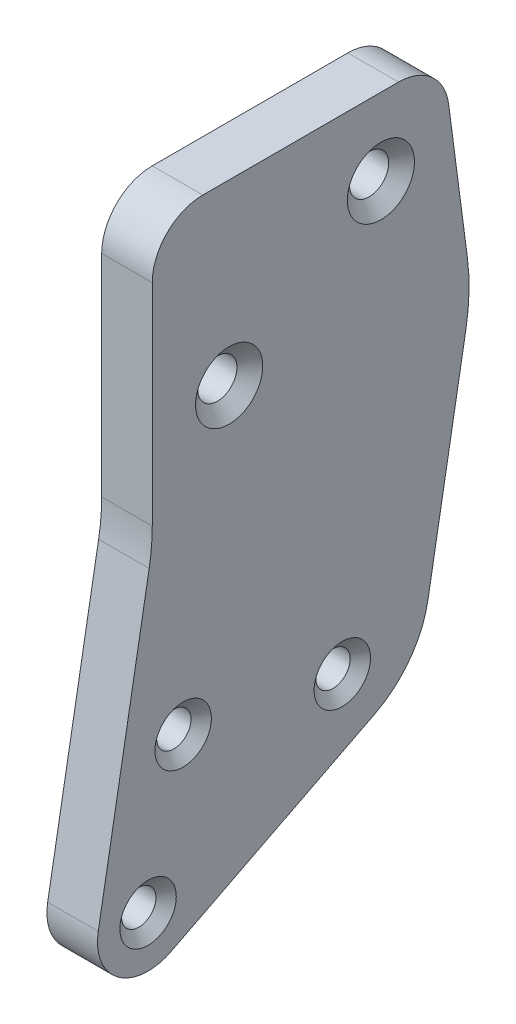
ISO-10303-21;
HEADER;
FILE_DESCRIPTION(('STEP AP214'),'2;1');
FILE_NAME('part.step','',(''),(''),'','','');
FILE_SCHEMA(('AUTOMOTIVE_DESIGN { 1 0 10303 214 1 1 1 1 }'));
ENDSEC;
DATA;
#1=APPLICATION_CONTEXT('core data for automotive mechanical design processes');
#2=APPLICATION_PROTOCOL_DEFINITION('international standard','automotive_design',2000,#1);
#3=PRODUCT_CONTEXT('',#1,'mechanical');
#4=PRODUCT('Part','Part','',(#3));
#5=PRODUCT_RELATED_PRODUCT_CATEGORY('part','',(#4));
#6=PRODUCT_DEFINITION_FORMATION('','',#4);
#7=PRODUCT_DEFINITION_CONTEXT('part definition',#1,'design');
#8=PRODUCT_DEFINITION('design','',#6,#7);
#9=PRODUCT_DEFINITION_SHAPE('','',#8);
#10=(LENGTH_UNIT() NAMED_UNIT(*) SI_UNIT(.MILLI.,.METRE.));
#11=(NAMED_UNIT(*) PLANE_ANGLE_UNIT() SI_UNIT($,.RADIAN.));
#12=(NAMED_UNIT(*) SI_UNIT($,.STERADIAN.) SOLID_ANGLE_UNIT());
#13=UNCERTAINTY_MEASURE_WITH_UNIT(LENGTH_MEASURE(1.E-05),#10,'distance_accuracy_value','');
#14=(GEOMETRIC_REPRESENTATION_CONTEXT(3) GLOBAL_UNCERTAINTY_ASSIGNED_CONTEXT((#13)) GLOBAL_UNIT_ASSIGNED_CONTEXT((#10,
#11,#12)) REPRESENTATION_CONTEXT('',''));
#15=CARTESIAN_POINT('',(0.,0.,0.));
#16=DIRECTION('',(0.,0.,1.));
#17=DIRECTION('',(1.,0.,0.));
#18=AXIS2_PLACEMENT_3D('',#15,#16,#17);
#19=CARTESIAN_POINT('',(11.3858279648977,236.686454414129,-110.25444916025));
#20=DIRECTION('',(0.,-0.173648177666931,-0.984807753012208));
#21=DIRECTION('',(0.,0.984807753012208,-0.173648177666931));
#22=AXIS2_PLACEMENT_3D('',#19,#20,#21);
#23=PLANE('',#22);
#24=DIRECTION('',(0.,0.984807753012208,-0.173648177666931));
#25=VECTOR('',#24,1.);
#26=CARTESIAN_POINT('',(5.03582796489774,236.686454414129,-110.25444916025));
#27=LINE('',#26,#25);
#28=CARTESIAN_POINT('',(5.03582796489773,257.059360574544,-113.846742191773));
#29=VERTEX_POINT('',#28);
#30=CARTESIAN_POINT('',(5.03582796489771,293.322725273824,-120.240951799527));
#31=VERTEX_POINT('',#30);
#32=EDGE_CURVE('E131',#29,#31,#27,.T.);
#33=ORIENTED_EDGE('',*,*,#32,.F.);
#34=DIRECTION('',(1.,0.,0.));
#35=VECTOR('',#34,1.);
#36=CARTESIAN_POINT('',(11.3858279648977,257.059360574544,-113.846742191773));
#37=LINE('',#36,#35);
#38=CARTESIAN_POINT('',(11.3858279648977,257.059360574544,-113.846742191773));
#39=VERTEX_POINT('',#38);
#40=EDGE_CURVE('E172',#29,#39,#37,.T.);
#41=ORIENTED_EDGE('',*,*,#40,.T.);
#42=DIRECTION('',(0.,0.984807753012208,-0.173648177666931));
#43=VECTOR('',#42,1.);
#44=CARTESIAN_POINT('',(11.3858279648977,236.686454414129,-110.25444916025));
#45=LINE('',#44,#43);
#46=CARTESIAN_POINT('',(11.3858279648977,293.322725273824,-120.240951799527));
#47=VERTEX_POINT('',#46);
#48=EDGE_CURVE('E160',#39,#47,#45,.T.);
#49=ORIENTED_EDGE('',*,*,#48,.T.);
#50=DIRECTION('',(-1.,0.,0.));
#51=VECTOR('',#50,1.);
#52=CARTESIAN_POINT('',(11.3858279648977,293.322725273824,-120.240951799527));
#53=LINE('',#52,#51);
#54=EDGE_CURVE('E136',#31,#47,#53,.F.);
#55=ORIENTED_EDGE('',*,*,#54,.F.);
#56=EDGE_LOOP('',(#33,#41,#49,#55));
#57=FACE_BOUND('',#56,.T.);
#58=ADVANCED_FACE('F36',(#57),#23,.F.);
#59=CARTESIAN_POINT('',(11.3858279648977,330.559017517181,-120.626834873017));
#60=DIRECTION('',(0.,0.,-1.));
#61=DIRECTION('',(1.,0.,0.));
#62=AXIS2_PLACEMENT_3D('',#59,#60,#61);
#63=PLANE('',#62);
#64=DIRECTION('',(0.,1.,0.));
#65=VECTOR('',#64,1.);
#66=CARTESIAN_POINT('',(5.0358279648977,330.559017517181,-120.626834873017));
#67=LINE('',#66,#65);
#68=CARTESIAN_POINT('',(5.03582796489771,297.733388986564,-120.626834873017));
#69=VERTEX_POINT('',#68);
#70=CARTESIAN_POINT('',(5.0358279648977,324.209017517181,-120.626834873017));
#71=VERTEX_POINT('',#70);
#72=EDGE_CURVE('E129',#69,#71,#67,.T.);
#73=ORIENTED_EDGE('',*,*,#72,.F.);
#74=DIRECTION('',(-1.,0.,0.));
#75=VECTOR('',#74,1.);
#76=CARTESIAN_POINT('',(5.03582796489771,297.733388986564,-120.626834873017));
#77=LINE('',#76,#75);
#78=CARTESIAN_POINT('',(11.3858279648977,297.733388986564,-120.626834873017));
#79=VERTEX_POINT('',#78);
#80=EDGE_CURVE('E139',#79,#69,#77,.T.);
#81=ORIENTED_EDGE('',*,*,#80,.F.);
#82=DIRECTION('',(0.,1.,0.));
#83=VECTOR('',#82,1.);
#84=CARTESIAN_POINT('',(11.3858279648977,330.559017517181,-120.626834873017));
#85=LINE('',#84,#83);
#86=CARTESIAN_POINT('',(11.3858279648977,324.209017517181,-120.626834873017));
#87=VERTEX_POINT('',#86);
#88=EDGE_CURVE('E265',#79,#87,#85,.T.);
#89=ORIENTED_EDGE('',*,*,#88,.T.);
#90=DIRECTION('',(-1.,0.,0.));
#91=VECTOR('',#90,1.);
#92=CARTESIAN_POINT('',(11.3858279648977,324.209017517181,-120.626834873017));
#93=LINE('',#92,#91);
#94=EDGE_CURVE('E150',#71,#87,#93,.F.);
#95=ORIENTED_EDGE('',*,*,#94,.F.);
#96=EDGE_LOOP('',(#73,#81,#89,#95));
#97=FACE_BOUND('',#96,.T.);
#98=ADVANCED_FACE('F148',(#97),#63,.F.);
#99=CARTESIAN_POINT('',(11.3858279648977,330.559017517181,-159.045133050029));
#100=DIRECTION('',(0.,-1.,0.));
#101=DIRECTION('',(-1.,0.,0.));
#102=AXIS2_PLACEMENT_3D('',#99,#100,#101);
#103=PLANE('',#102);
#104=DIRECTION('',(0.,0.,-1.));
#105=VECTOR('',#104,1.);
#106=CARTESIAN_POINT('',(11.3858279648977,330.559017517181,-159.045133050029));
#107=LINE('',#106,#105);
#108=CARTESIAN_POINT('',(11.3858279648977,330.559017517181,-126.976834873017));
#109=VERTEX_POINT('',#108);
#110=CARTESIAN_POINT('',(11.3858279648977,330.559017517181,-151.538391015809));
#111=VERTEX_POINT('',#110);
#112=EDGE_CURVE('E267',#109,#111,#107,.T.);
#113=ORIENTED_EDGE('',*,*,#112,.T.);
#114=DIRECTION('',(-1.,0.,0.));
#115=VECTOR('',#114,1.);
#116=CARTESIAN_POINT('',(11.3858279648977,330.559017517181,-151.538391015809));
#117=LINE('',#116,#115);
#118=CARTESIAN_POINT('',(5.0358279648977,330.559017517181,-151.538391015809));
#119=VERTEX_POINT('',#118);
#120=EDGE_CURVE('E187',#111,#119,#117,.T.);
#121=ORIENTED_EDGE('',*,*,#120,.T.);
#122=DIRECTION('',(0.,0.,-1.));
#123=VECTOR('',#122,1.);
#124=CARTESIAN_POINT('',(5.0358279648977,330.559017517181,-159.045133050029));
#125=LINE('',#124,#123);
#126=CARTESIAN_POINT('',(5.0358279648977,330.559017517181,-126.976834873017));
#127=VERTEX_POINT('',#126);
#128=EDGE_CURVE('E151',#127,#119,#125,.T.);
#129=ORIENTED_EDGE('',*,*,#128,.F.);
#130=DIRECTION('',(-1.,0.,0.));
#131=VECTOR('',#130,1.);
#132=CARTESIAN_POINT('',(11.3858279648977,330.559017517181,-126.976834873017));
#133=LINE('',#132,#131);
#134=EDGE_CURVE('E168',#109,#127,#133,.T.);
#135=ORIENTED_EDGE('',*,*,#134,.F.);
#136=EDGE_LOOP('',(#113,#121,#129,#135));
#137=FACE_BOUND('',#136,.T.);
#138=ADVANCED_FACE('F287',(#137),#103,.F.);
#139=CARTESIAN_POINT('',(11.3858279648977,230.070458845019,-147.775624550014));
#140=DIRECTION('',(0.,0.173648177666931,0.984807753012208));
#141=DIRECTION('',(0.,-0.984807753012208,0.173648177666931));
#142=AXIS2_PLACEMENT_3D('',#139,#140,#141);
#143=PLANE('',#142);
#144=DIRECTION('',(0.,-0.984807753012208,0.173648177666931));
#145=VECTOR('',#144,1.);
#146=CARTESIAN_POINT('',(11.3858279648977,230.070458845019,-147.775624550014));
#147=LINE('',#146,#145);
#148=CARTESIAN_POINT('',(11.3858279648977,299.489903530856,-160.016145633926));
#149=VERTEX_POINT('',#148);
#150=CARTESIAN_POINT('',(11.3858279648977,272.410748785464,-155.241360037534));
#151=VERTEX_POINT('',#150);
#152=EDGE_CURVE('E145',#149,#151,#147,.T.);
#153=ORIENTED_EDGE('',*,*,#152,.T.);
#154=DIRECTION('',(1.,0.,0.));
#155=VECTOR('',#154,1.);
#156=CARTESIAN_POINT('',(11.3858279648977,272.410748785464,-155.241360037534));
#157=LINE('',#156,#155);
#158=CARTESIAN_POINT('',(5.03582796489772,272.410748785464,-155.241360037534));
#159=VERTEX_POINT('',#158);
#160=EDGE_CURVE('E44',#151,#159,#157,.F.);
#161=ORIENTED_EDGE('',*,*,#160,.T.);
#162=DIRECTION('',(0.,-0.984807753012208,0.173648177666931));
#163=VECTOR('',#162,1.);
#164=CARTESIAN_POINT('',(5.03582796489774,230.070458845019,-147.775624550014));
#165=LINE('',#164,#163);
#166=CARTESIAN_POINT('',(5.03582796489771,299.489903530856,-160.016145633926));
#167=VERTEX_POINT('',#166);
#168=EDGE_CURVE('E154',#167,#159,#165,.T.);
#169=ORIENTED_EDGE('',*,*,#168,.F.);
#170=DIRECTION('',(1.,0.,0.));
#171=VECTOR('',#170,1.);
#172=CARTESIAN_POINT('',(11.3858279648977,299.489903530856,-160.016145633926));
#173=LINE('',#172,#171);
#174=EDGE_CURVE('E192',#167,#149,#173,.T.);
#175=ORIENTED_EDGE('',*,*,#174,.T.);
#176=EDGE_LOOP('',(#153,#161,#169,#175));
#177=FACE_BOUND('',#176,.T.);
#178=ADVANCED_FACE('F269',(#177),#143,.F.);
#179=CARTESIAN_POINT('',(11.3858279648978,0.,0.));
#180=DIRECTION('',(1.,0.,0.));
#181=DIRECTION('',(0.,-1.,0.));
#182=AXIS2_PLACEMENT_3D('',#179,#180,#181);
#183=PLANE('',#182);
#184=CARTESIAN_POINT('',(11.3858279648977,255.956694646359,-120.100271423401));
#185=DIRECTION('',(1.,0.,0.));
#186=DIRECTION('',(0.,0.,-1.));
#187=AXIS2_PLACEMENT_3D('',#184,#185,#186);
#188=CIRCLE('',#187,3.54329999999997);
#189=CARTESIAN_POINT('',(11.3858279648977,255.956694646359,-123.643571423401));
#190=VERTEX_POINT('',#189);
#191=EDGE_CURVE('E528',#190,#190,#188,.T.);
#192=ORIENTED_EDGE('',*,*,#191,.F.);
#193=EDGE_LOOP('',(#192));
#194=FACE_BOUND('',#193,.T.);
#195=DIRECTION('',(0.,-0.453990499739543,0.89100652418837));
#196=VECTOR('',#195,1.);
#197=CARTESIAN_POINT('',(11.3858279648977,244.516721354372,-111.635136487965));
#198=LINE('',#197,#196);
#199=CARTESIAN_POINT('',(11.3858279648977,263.300297784642,-148.499980920971));
#200=VERTEX_POINT('',#199);
#201=CARTESIAN_POINT('',(11.3858279648977,250.298803217763,-122.983111096747));
#202=VERTEX_POINT('',#201);
#203=EDGE_CURVE('E208',#200,#202,#198,.T.);
#204=ORIENTED_EDGE('',*,*,#203,.F.);
#205=CARTESIAN_POINT('',(11.3858279648977,274.616080641834,-142.734301574279));
#206=DIRECTION('',(1.,0.,0.));
#207=DIRECTION('',(0.,1.,0.));
#208=AXIS2_PLACEMENT_3D('',#205,#206,#207);
#209=CIRCLE('',#208,12.7);
#210=EDGE_CURVE('E58',#200,#151,#209,.T.);
#211=ORIENTED_EDGE('',*,*,#210,.T.);
#212=ORIENTED_EDGE('',*,*,#152,.F.);
#213=CARTESIAN_POINT('',(11.3858279648977,303.900567243596,-135.002028707416));
#214=DIRECTION('',(1.,0.,0.));
#215=DIRECTION('',(0.,1.,0.));
#216=AXIS2_PLACEMENT_3D('',#213,#214,#215);
#217=CIRCLE('',#216,25.4);
#218=CARTESIAN_POINT('',(11.3858279648977,307.221990459447,-160.183929902942));
#219=VERTEX_POINT('',#218);
#220=EDGE_CURVE('E195',#149,#219,#217,.T.);
#221=ORIENTED_EDGE('',*,*,#220,.T.);
#222=DIRECTION('',(0.,-0.9914134328947,-0.130764693537463));
#223=VECTOR('',#222,1.);
#224=CARTESIAN_POINT('',(11.3858279648977,303.343024430755,-160.69555480851));
#225=LINE('',#224,#223);
#226=CARTESIAN_POINT('',(11.3858279648977,325.039373321144,-157.83386631469));
#227=VERTEX_POINT('',#226);
#228=EDGE_CURVE('E218',#227,#219,#225,.T.);
#229=ORIENTED_EDGE('',*,*,#228,.F.);
#230=CARTESIAN_POINT('',(11.3858279648977,324.209017517181,-151.538391015809));
#231=DIRECTION('',(1.,0.,0.));
#232=DIRECTION('',(0.,1.,0.));
#233=AXIS2_PLACEMENT_3D('',#230,#231,#232);
#234=CIRCLE('',#233,6.35);
#235=EDGE_CURVE('E175',#227,#111,#234,.T.);
#236=ORIENTED_EDGE('',*,*,#235,.T.);
#237=ORIENTED_EDGE('',*,*,#112,.F.);
#238=CARTESIAN_POINT('',(11.3858279648977,324.209017517181,-126.976834873017));
#239=DIRECTION('',(-1.,0.,0.));
#240=DIRECTION('',(0.,-1.,0.));
#241=AXIS2_PLACEMENT_3D('',#238,#239,#240);
#242=CIRCLE('',#241,6.35);
#243=EDGE_CURVE('E166',#87,#109,#242,.T.);
#244=ORIENTED_EDGE('',*,*,#243,.F.);
#245=ORIENTED_EDGE('',*,*,#88,.F.);
#246=CARTESIAN_POINT('',(11.3858279648977,297.733388986564,-95.2268348730171));
#247=DIRECTION('',(-1.,0.,0.));
#248=DIRECTION('',(0.,-1.,0.));
#249=AXIS2_PLACEMENT_3D('',#246,#247,#248);
#250=CIRCLE('',#249,25.4);
#251=EDGE_CURVE('E135',#47,#79,#250,.F.);
#252=ORIENTED_EDGE('',*,*,#251,.F.);
#253=ORIENTED_EDGE('',*,*,#48,.F.);
#254=CARTESIAN_POINT('',(11.3858279648977,255.956694646359,-120.100271423401));
#255=DIRECTION('',(1.,0.,0.));
#256=DIRECTION('',(0.,1.,0.));
#257=AXIS2_PLACEMENT_3D('',#254,#255,#256);
#258=CIRCLE('',#257,6.35);
#259=EDGE_CURVE('E177',#39,#202,#258,.T.);
#260=ORIENTED_EDGE('',*,*,#259,.T.);
#261=EDGE_LOOP('',(#204,#211,#212,#221,#229,#236,#237,#244,#245,#252,#253,#260));
#262=FACE_BOUND('',#261,.T.);
#263=CARTESIAN_POINT('',(11.3858279648977,320.907017517181,-149.328834873017));
#264=DIRECTION('',(-1.,0.,0.));
#265=DIRECTION('',(0.,0.,1.));
#266=AXIS2_PLACEMENT_3D('',#263,#264,#265);
#267=CIRCLE('',#266,4.21640000000001);
#268=CARTESIAN_POINT('',(11.3858279648977,320.907017517181,-145.112434873017));
#269=VERTEX_POINT('',#268);
#270=EDGE_CURVE('E227',#269,#269,#267,.T.);
#271=ORIENTED_EDGE('',*,*,#270,.T.);
#272=EDGE_LOOP('',(#271));
#273=FACE_BOUND('',#272,.T.);
#274=CARTESIAN_POINT('',(11.3858279648977,308.207017517181,-130.278834873017));
#275=DIRECTION('',(-1.,0.,0.));
#276=DIRECTION('',(0.,0.,1.));
#277=AXIS2_PLACEMENT_3D('',#274,#275,#276);
#278=CIRCLE('',#277,4.21640000000001);
#279=CARTESIAN_POINT('',(11.3858279648977,308.207017517181,-126.062434873017));
#280=VERTEX_POINT('',#279);
#281=EDGE_CURVE('E238',#280,#280,#278,.T.);
#282=ORIENTED_EDGE('',*,*,#281,.T.);
#283=EDGE_LOOP('',(#282));
#284=FACE_BOUND('',#283,.T.);
#285=CARTESIAN_POINT('',(11.3858279648977,273.13941545584,-124.504125042983));
#286=DIRECTION('',(-1.,0.,0.));
#287=DIRECTION('',(0.,0.,1.));
#288=AXIS2_PLACEMENT_3D('',#285,#286,#287);
#289=CIRCLE('',#288,3.54329999999997);
#290=CARTESIAN_POINT('',(11.3858279648977,273.13941545584,-120.960825042983));
#291=VERTEX_POINT('',#290);
#292=EDGE_CURVE('E247',#291,#291,#289,.T.);
#293=ORIENTED_EDGE('',*,*,#292,.T.);
#294=EDGE_LOOP('',(#293));
#295=FACE_BOUND('',#294,.T.);
#296=CARTESIAN_POINT('',(11.3858279648977,269.72417914843,-144.485224024571));
#297=DIRECTION('',(-1.,0.,0.));
#298=DIRECTION('',(0.,0.,1.));
#299=AXIS2_PLACEMENT_3D('',#296,#297,#298);
#300=CIRCLE('',#299,3.54329999999997);
#301=CARTESIAN_POINT('',(11.3858279648977,269.72417914843,-140.941924024571));
#302=VERTEX_POINT('',#301);
#303=EDGE_CURVE('E256',#302,#302,#300,.T.);
#304=ORIENTED_EDGE('',*,*,#303,.T.);
#305=EDGE_LOOP('',(#304));
#306=FACE_BOUND('',#305,.T.);
#307=ADVANCED_FACE('F212',(#194,#262,#273,#284,#295,#306),#183,.T.);
#308=CARTESIAN_POINT('',(5.03582796489783,0.,0.));
#309=DIRECTION('',(1.,0.,0.));
#310=DIRECTION('',(0.,-1.,0.));
#311=AXIS2_PLACEMENT_3D('',#308,#309,#310);
#312=PLANE('',#311);
#313=CARTESIAN_POINT('',(5.03582796489759,255.956694646359,-120.100271423401));
#314=DIRECTION('',(1.,0.,0.));
#315=DIRECTION('',(0.,0.,-1.));
#316=AXIS2_PLACEMENT_3D('',#313,#314,#315);
#317=CIRCLE('',#316,2.15264999999998);
#318=CARTESIAN_POINT('',(5.03582796489759,255.956694646359,-122.252921423401));
#319=VERTEX_POINT('',#318);
#320=EDGE_CURVE('E216',#319,#319,#317,.T.);
#321=ORIENTED_EDGE('',*,*,#320,.T.);
#322=EDGE_LOOP('',(#321));
#323=FACE_BOUND('',#322,.T.);
#324=CARTESIAN_POINT('',(5.03582796489763,320.907017517181,-149.328834873017));
#325=DIRECTION('',(-1.,0.,0.));
#326=DIRECTION('',(0.,0.,1.));
#327=AXIS2_PLACEMENT_3D('',#324,#325,#326);
#328=CIRCLE('',#327,2.45744999999997);
#329=CARTESIAN_POINT('',(5.03582796489763,320.907017517181,-146.871384873017));
#330=VERTEX_POINT('',#329);
#331=EDGE_CURVE('E235',#330,#330,#328,.T.);
#332=ORIENTED_EDGE('',*,*,#331,.F.);
#333=EDGE_LOOP('',(#332));
#334=FACE_BOUND('',#333,.T.);
#335=CARTESIAN_POINT('',(5.03582796489764,308.207017517181,-130.278834873017));
#336=DIRECTION('',(-1.,0.,0.));
#337=DIRECTION('',(0.,0.,1.));
#338=AXIS2_PLACEMENT_3D('',#335,#336,#337);
#339=CIRCLE('',#338,2.45744999999997);
#340=CARTESIAN_POINT('',(5.03582796489764,308.207017517181,-127.821384873017));
#341=VERTEX_POINT('',#340);
#342=EDGE_CURVE('E244',#341,#341,#339,.T.);
#343=ORIENTED_EDGE('',*,*,#342,.F.);
#344=EDGE_LOOP('',(#343));
#345=FACE_BOUND('',#344,.T.);
#346=CARTESIAN_POINT('',(5.03582796489768,273.13941545584,-124.504125042983));
#347=DIRECTION('',(-1.,0.,0.));
#348=DIRECTION('',(0.,0.,1.));
#349=AXIS2_PLACEMENT_3D('',#346,#347,#348);
#350=CIRCLE('',#349,2.15264999999998);
#351=CARTESIAN_POINT('',(5.03582796489768,273.13941545584,-122.351475042983));
#352=VERTEX_POINT('',#351);
#353=EDGE_CURVE('E253',#352,#352,#350,.T.);
#354=ORIENTED_EDGE('',*,*,#353,.F.);
#355=EDGE_LOOP('',(#354));
#356=FACE_BOUND('',#355,.T.);
#357=CARTESIAN_POINT('',(5.03582796489768,269.72417914843,-144.485224024571));
#358=DIRECTION('',(-1.,0.,0.));
#359=DIRECTION('',(0.,0.,1.));
#360=AXIS2_PLACEMENT_3D('',#357,#358,#359);
#361=CIRCLE('',#360,2.15264999999998);
#362=CARTESIAN_POINT('',(5.03582796489768,269.72417914843,-142.332574024571));
#363=VERTEX_POINT('',#362);
#364=EDGE_CURVE('E156',#363,#363,#361,.T.);
#365=ORIENTED_EDGE('',*,*,#364,.F.);
#366=EDGE_LOOP('',(#365));
#367=FACE_BOUND('',#366,.T.);
#368=ORIENTED_EDGE('',*,*,#168,.T.);
#369=CARTESIAN_POINT('',(5.03582796489772,274.616080641834,-142.734301574279));
#370=DIRECTION('',(1.,0.,0.));
#371=DIRECTION('',(0.,1.,0.));
#372=AXIS2_PLACEMENT_3D('',#369,#370,#371);
#373=CIRCLE('',#372,12.7);
#374=CARTESIAN_POINT('',(5.03582796489759,263.300297784642,-148.499980920971));
#375=VERTEX_POINT('',#374);
#376=EDGE_CURVE('E11',#159,#375,#373,.F.);
#377=ORIENTED_EDGE('',*,*,#376,.T.);
#378=DIRECTION('',(0.,-0.453990499739543,0.89100652418837));
#379=VECTOR('',#378,1.);
#380=CARTESIAN_POINT('',(5.0358279648976,244.516721354372,-111.635136487965));
#381=LINE('',#380,#379);
#382=CARTESIAN_POINT('',(5.03582796489759,250.298803217763,-122.983111096747));
#383=VERTEX_POINT('',#382);
#384=EDGE_CURVE('E209',#375,#383,#381,.T.);
#385=ORIENTED_EDGE('',*,*,#384,.T.);
#386=CARTESIAN_POINT('',(5.03582796489773,255.956694646359,-120.100271423401));
#387=DIRECTION('',(1.,0.,0.));
#388=DIRECTION('',(0.,1.,0.));
#389=AXIS2_PLACEMENT_3D('',#386,#387,#388);
#390=CIRCLE('',#389,6.35);
#391=EDGE_CURVE('E185',#383,#29,#390,.F.);
#392=ORIENTED_EDGE('',*,*,#391,.T.);
#393=ORIENTED_EDGE('',*,*,#32,.T.);
#394=CARTESIAN_POINT('',(5.03582796489771,297.733388986564,-95.2268348730171));
#395=DIRECTION('',(-1.,0.,0.));
#396=DIRECTION('',(0.,-1.,0.));
#397=AXIS2_PLACEMENT_3D('',#394,#395,#396);
#398=CIRCLE('',#397,25.4);
#399=EDGE_CURVE('E125',#69,#31,#398,.T.);
#400=ORIENTED_EDGE('',*,*,#399,.F.);
#401=ORIENTED_EDGE('',*,*,#72,.T.);
#402=CARTESIAN_POINT('',(5.0358279648977,324.209017517181,-126.976834873017));
#403=DIRECTION('',(-1.,0.,0.));
#404=DIRECTION('',(0.,-1.,0.));
#405=AXIS2_PLACEMENT_3D('',#402,#403,#404);
#406=CIRCLE('',#405,6.35);
#407=EDGE_CURVE('E164',#127,#71,#406,.F.);
#408=ORIENTED_EDGE('',*,*,#407,.F.);
#409=ORIENTED_EDGE('',*,*,#128,.T.);
#410=CARTESIAN_POINT('',(5.0358279648977,324.209017517181,-151.538391015809));
#411=DIRECTION('',(1.,0.,0.));
#412=DIRECTION('',(0.,1.,0.));
#413=AXIS2_PLACEMENT_3D('',#410,#411,#412);
#414=CIRCLE('',#413,6.35);
#415=CARTESIAN_POINT('',(5.03582796489759,325.039373321144,-157.83386631469));
#416=VERTEX_POINT('',#415);
#417=EDGE_CURVE('E183',#119,#416,#414,.F.);
#418=ORIENTED_EDGE('',*,*,#417,.T.);
#419=DIRECTION('',(0.,-0.9914134328947,-0.130764693537463));
#420=VECTOR('',#419,1.);
#421=CARTESIAN_POINT('',(5.0358279648976,303.343024430755,-160.69555480851));
#422=LINE('',#421,#420);
#423=CARTESIAN_POINT('',(5.0358279648976,307.221990459447,-160.183929902942));
#424=VERTEX_POINT('',#423);
#425=EDGE_CURVE('E224',#416,#424,#422,.T.);
#426=ORIENTED_EDGE('',*,*,#425,.T.);
#427=CARTESIAN_POINT('',(5.03582796489771,303.900567243596,-135.002028707416));
#428=DIRECTION('',(1.,0.,0.));
#429=DIRECTION('',(0.,1.,0.));
#430=AXIS2_PLACEMENT_3D('',#427,#428,#429);
#431=CIRCLE('',#430,25.4);
#432=EDGE_CURVE('E199',#424,#167,#431,.F.);
#433=ORIENTED_EDGE('',*,*,#432,.T.);
#434=EDGE_LOOP('',(#368,#377,#385,#392,#393,#400,#401,#408,#409,#418,#426,#433));
#435=FACE_BOUND('',#434,.T.);
#436=ADVANCED_FACE('F127',(#323,#334,#345,#356,#367,#435),#312,.F.);
#437=CARTESIAN_POINT('',(11.3858279648977,297.733388986564,-95.2268348730171));
#438=DIRECTION('',(1.,0.,0.));
#439=DIRECTION('',(0.,-1.,0.));
#440=AXIS2_PLACEMENT_3D('',#437,#438,#439);
#441=CYLINDRICAL_SURFACE('',#440,25.4);
#442=ORIENTED_EDGE('',*,*,#251,.T.);
#443=ORIENTED_EDGE('',*,*,#80,.T.);
#444=ORIENTED_EDGE('',*,*,#399,.T.);
#445=ORIENTED_EDGE('',*,*,#54,.T.);
#446=EDGE_LOOP('',(#442,#443,#444,#445));
#447=FACE_BOUND('',#446,.T.);
#448=ADVANCED_FACE('F140',(#447),#441,.F.);
#449=CARTESIAN_POINT('',(11.3858279648977,269.72417914843,-144.485224024571));
#450=DIRECTION('',(1.,0.,0.));
#451=DIRECTION('',(0.,0.,1.));
#452=AXIS2_PLACEMENT_3D('',#449,#450,#451);
#453=CYLINDRICAL_SURFACE('',#452,2.15264999999998);
#454=ORIENTED_EDGE('',*,*,#364,.T.);
#455=EDGE_LOOP('',(#454));
#456=FACE_BOUND('',#455,.T.);
#457=CARTESIAN_POINT('',(10.218934062801,269.72417914843,-144.485224024571));
#458=DIRECTION('',(-1.,0.,0.));
#459=DIRECTION('',(0.,0.,1.));
#460=AXIS2_PLACEMENT_3D('',#457,#458,#459);
#461=CIRCLE('',#460,2.15264999999998);
#462=CARTESIAN_POINT('',(10.218934062801,269.72417914843,-142.332574024571));
#463=VERTEX_POINT('',#462);
#464=EDGE_CURVE('E259',#463,#463,#461,.T.);
#465=ORIENTED_EDGE('',*,*,#464,.F.);
#466=EDGE_LOOP('',(#465));
#467=FACE_BOUND('',#466,.T.);
#468=ADVANCED_FACE('F314',(#456,#467),#453,.F.);
#469=CARTESIAN_POINT('',(11.3858279648977,269.72417914843,-144.485224024571));
#470=DIRECTION('',(1.,0.,0.));
#471=DIRECTION('',(0.,0.,1.));
#472=AXIS2_PLACEMENT_3D('',#469,#470,#471);
#473=CONICAL_SURFACE('',#472,3.54329999999997,0.872664625997165);
#474=ORIENTED_EDGE('',*,*,#464,.T.);
#475=EDGE_LOOP('',(#474));
#476=FACE_BOUND('',#475,.T.);
#477=ORIENTED_EDGE('',*,*,#303,.F.);
#478=EDGE_LOOP('',(#477));
#479=FACE_BOUND('',#478,.T.);
#480=ADVANCED_FACE('F347',(#476,#479),#473,.F.);
#481=CARTESIAN_POINT('',(11.3858279648977,273.13941545584,-124.504125042983));
#482=DIRECTION('',(1.,0.,0.));
#483=DIRECTION('',(0.,0.,1.));
#484=AXIS2_PLACEMENT_3D('',#481,#482,#483);
#485=CYLINDRICAL_SURFACE('',#484,2.15264999999998);
#486=ORIENTED_EDGE('',*,*,#353,.T.);
#487=EDGE_LOOP('',(#486));
#488=FACE_BOUND('',#487,.T.);
#489=CARTESIAN_POINT('',(10.218934062801,273.13941545584,-124.504125042983));
#490=DIRECTION('',(-1.,0.,0.));
#491=DIRECTION('',(0.,0.,1.));
#492=AXIS2_PLACEMENT_3D('',#489,#490,#491);
#493=CIRCLE('',#492,2.15264999999998);
#494=CARTESIAN_POINT('',(10.218934062801,273.13941545584,-122.351475042983));
#495=VERTEX_POINT('',#494);
#496=EDGE_CURVE('E250',#495,#495,#493,.T.);
#497=ORIENTED_EDGE('',*,*,#496,.F.);
#498=EDGE_LOOP('',(#497));
#499=FACE_BOUND('',#498,.T.);
#500=ADVANCED_FACE('F343',(#488,#499),#485,.F.);
#501=CARTESIAN_POINT('',(11.3858279648977,273.13941545584,-124.504125042983));
#502=DIRECTION('',(1.,0.,0.));
#503=DIRECTION('',(0.,0.,1.));
#504=AXIS2_PLACEMENT_3D('',#501,#502,#503);
#505=CONICAL_SURFACE('',#504,3.54329999999997,0.872664625997165);
#506=ORIENTED_EDGE('',*,*,#496,.T.);
#507=EDGE_LOOP('',(#506));
#508=FACE_BOUND('',#507,.T.);
#509=ORIENTED_EDGE('',*,*,#292,.F.);
#510=EDGE_LOOP('',(#509));
#511=FACE_BOUND('',#510,.T.);
#512=ADVANCED_FACE('F339',(#508,#511),#505,.F.);
#513=CARTESIAN_POINT('',(11.3858279648977,308.207017517181,-130.278834873017));
#514=DIRECTION('',(1.,0.,0.));
#515=DIRECTION('',(0.,0.,1.));
#516=AXIS2_PLACEMENT_3D('',#513,#514,#515);
#517=CYLINDRICAL_SURFACE('',#516,2.45744999999997);
#518=ORIENTED_EDGE('',*,*,#342,.T.);
#519=EDGE_LOOP('',(#518));
#520=FACE_BOUND('',#519,.T.);
#521=CARTESIAN_POINT('',(9.90989366863843,308.207017517181,-130.278834873017));
#522=DIRECTION('',(-1.,0.,0.));
#523=DIRECTION('',(0.,0.,1.));
#524=AXIS2_PLACEMENT_3D('',#521,#522,#523);
#525=CIRCLE('',#524,2.45744999999997);
#526=CARTESIAN_POINT('',(9.90989366863843,308.207017517181,-127.821384873017));
#527=VERTEX_POINT('',#526);
#528=EDGE_CURVE('E241',#527,#527,#525,.T.);
#529=ORIENTED_EDGE('',*,*,#528,.F.);
#530=EDGE_LOOP('',(#529));
#531=FACE_BOUND('',#530,.T.);
#532=ADVANCED_FACE('F335',(#520,#531),#517,.F.);
#533=CARTESIAN_POINT('',(11.3858279648977,308.207017517181,-130.278834873017));
#534=DIRECTION('',(1.,0.,0.));
#535=DIRECTION('',(0.,0.,1.));
#536=AXIS2_PLACEMENT_3D('',#533,#534,#535);
#537=CONICAL_SURFACE('',#536,4.21640000000001,0.872664625997174);
#538=ORIENTED_EDGE('',*,*,#528,.T.);
#539=EDGE_LOOP('',(#538));
#540=FACE_BOUND('',#539,.T.);
#541=ORIENTED_EDGE('',*,*,#281,.F.);
#542=EDGE_LOOP('',(#541));
#543=FACE_BOUND('',#542,.T.);
#544=ADVANCED_FACE('F328',(#540,#543),#537,.F.);
#545=CARTESIAN_POINT('',(11.3858279648977,320.907017517181,-149.328834873017));
#546=DIRECTION('',(1.,0.,0.));
#547=DIRECTION('',(0.,0.,1.));
#548=AXIS2_PLACEMENT_3D('',#545,#546,#547);
#549=CYLINDRICAL_SURFACE('',#548,2.45744999999997);
#550=ORIENTED_EDGE('',*,*,#331,.T.);
#551=EDGE_LOOP('',(#550));
#552=FACE_BOUND('',#551,.T.);
#553=CARTESIAN_POINT('',(9.90989366863842,320.907017517181,-149.328834873017));
#554=DIRECTION('',(-1.,0.,0.));
#555=DIRECTION('',(0.,0.,1.));
#556=AXIS2_PLACEMENT_3D('',#553,#554,#555);
#557=CIRCLE('',#556,2.45744999999997);
#558=CARTESIAN_POINT('',(9.90989366863842,320.907017517181,-146.871384873017));
#559=VERTEX_POINT('',#558);
#560=EDGE_CURVE('E232',#559,#559,#557,.T.);
#561=ORIENTED_EDGE('',*,*,#560,.F.);
#562=EDGE_LOOP('',(#561));
#563=FACE_BOUND('',#562,.T.);
#564=ADVANCED_FACE('F322',(#552,#563),#549,.F.);
#565=CARTESIAN_POINT('',(11.3858279648977,320.907017517181,-149.328834873017));
#566=DIRECTION('',(1.,0.,0.));
#567=DIRECTION('',(0.,0.,1.));
#568=AXIS2_PLACEMENT_3D('',#565,#566,#567);
#569=CONICAL_SURFACE('',#568,4.21640000000001,0.872664625997174);
#570=ORIENTED_EDGE('',*,*,#560,.T.);
#571=EDGE_LOOP('',(#570));
#572=FACE_BOUND('',#571,.T.);
#573=ORIENTED_EDGE('',*,*,#270,.F.);
#574=EDGE_LOOP('',(#573));
#575=FACE_BOUND('',#574,.T.);
#576=ADVANCED_FACE('F316',(#572,#575),#569,.F.);
#577=CARTESIAN_POINT('',(11.3858279648977,324.209017517181,-126.976834873017));
#578=DIRECTION('',(-1.,0.,0.));
#579=DIRECTION('',(0.,1.,0.));
#580=AXIS2_PLACEMENT_3D('',#577,#578,#579);
#581=CYLINDRICAL_SURFACE('',#580,6.35);
#582=ORIENTED_EDGE('',*,*,#243,.T.);
#583=ORIENTED_EDGE('',*,*,#134,.T.);
#584=ORIENTED_EDGE('',*,*,#407,.T.);
#585=ORIENTED_EDGE('',*,*,#94,.T.);
#586=EDGE_LOOP('',(#582,#583,#584,#585));
#587=FACE_BOUND('',#586,.T.);
#588=ADVANCED_FACE('F290',(#587),#581,.T.);
#589=CARTESIAN_POINT('',(5.0358279648976,303.343024430755,-160.69555480851));
#590=DIRECTION('',(0.,-0.130764693537463,0.9914134328947));
#591=DIRECTION('',(0.,-0.9914134328947,-0.130764693537463));
#592=AXIS2_PLACEMENT_3D('',#589,#590,#591);
#593=PLANE('',#592);
#594=ORIENTED_EDGE('',*,*,#228,.T.);
#595=DIRECTION('',(1.,0.,0.));
#596=VECTOR('',#595,1.);
#597=CARTESIAN_POINT('',(5.0358279648976,307.221990459447,-160.183929902942));
#598=LINE('',#597,#596);
#599=EDGE_CURVE('E197',#219,#424,#598,.F.);
#600=ORIENTED_EDGE('',*,*,#599,.T.);
#601=ORIENTED_EDGE('',*,*,#425,.F.);
#602=DIRECTION('',(-1.,0.,0.));
#603=VECTOR('',#602,1.);
#604=CARTESIAN_POINT('',(5.03582796489759,325.039373321144,-157.83386631469));
#605=LINE('',#604,#603);
#606=EDGE_CURVE('E190',#416,#227,#605,.F.);
#607=ORIENTED_EDGE('',*,*,#606,.T.);
#608=EDGE_LOOP('',(#594,#600,#601,#607));
#609=FACE_BOUND('',#608,.T.);
#610=ADVANCED_FACE('F278',(#609),#593,.F.);
#611=CARTESIAN_POINT('',(5.0358279648976,244.516721354372,-111.635136487965));
#612=DIRECTION('',(0.,0.89100652418837,0.453990499739543));
#613=DIRECTION('',(0.,-0.453990499739543,0.89100652418837));
#614=AXIS2_PLACEMENT_3D('',#611,#612,#613);
#615=PLANE('',#614);
#616=ORIENTED_EDGE('',*,*,#384,.F.);
#617=DIRECTION('',(1.,0.,0.));
#618=VECTOR('',#617,1.);
#619=CARTESIAN_POINT('',(5.03582796489759,263.300297784642,-148.499980920971));
#620=LINE('',#619,#618);
#621=EDGE_CURVE('E201',#375,#200,#620,.T.);
#622=ORIENTED_EDGE('',*,*,#621,.T.);
#623=ORIENTED_EDGE('',*,*,#203,.T.);
#624=DIRECTION('',(1.,0.,0.));
#625=VECTOR('',#624,1.);
#626=CARTESIAN_POINT('',(5.03582796489759,250.298803217763,-122.983111096747));
#627=LINE('',#626,#625);
#628=EDGE_CURVE('E180',#202,#383,#627,.F.);
#629=ORIENTED_EDGE('',*,*,#628,.T.);
#630=EDGE_LOOP('',(#616,#622,#623,#629));
#631=FACE_BOUND('',#630,.T.);
#632=ADVANCED_FACE('F207',(#631),#615,.F.);
#633=CARTESIAN_POINT('',(11.3858279648977,255.956694646359,-120.100271423401));
#634=DIRECTION('',(1.,0.,0.));
#635=DIRECTION('',(0.,1.,0.));
#636=AXIS2_PLACEMENT_3D('',#633,#634,#635);
#637=CYLINDRICAL_SURFACE('',#636,6.35);
#638=ORIENTED_EDGE('',*,*,#391,.F.);
#639=ORIENTED_EDGE('',*,*,#628,.F.);
#640=ORIENTED_EDGE('',*,*,#259,.F.);
#641=ORIENTED_EDGE('',*,*,#40,.F.);
#642=EDGE_LOOP('',(#638,#639,#640,#641));
#643=FACE_BOUND('',#642,.T.);
#644=ADVANCED_FACE('F295',(#643),#637,.T.);
#645=CARTESIAN_POINT('',(11.3858279648977,324.209017517181,-151.538391015809));
#646=DIRECTION('',(-1.,0.,0.));
#647=DIRECTION('',(0.,-1.,0.));
#648=AXIS2_PLACEMENT_3D('',#645,#646,#647);
#649=CYLINDRICAL_SURFACE('',#648,6.35);
#650=ORIENTED_EDGE('',*,*,#235,.F.);
#651=ORIENTED_EDGE('',*,*,#606,.F.);
#652=ORIENTED_EDGE('',*,*,#417,.F.);
#653=ORIENTED_EDGE('',*,*,#120,.F.);
#654=EDGE_LOOP('',(#650,#651,#652,#653));
#655=FACE_BOUND('',#654,.T.);
#656=ADVANCED_FACE('F282',(#655),#649,.T.);
#657=CARTESIAN_POINT('',(11.3858279648977,303.900567243596,-135.002028707416));
#658=DIRECTION('',(1.,0.,0.));
#659=DIRECTION('',(0.,1.,0.));
#660=AXIS2_PLACEMENT_3D('',#657,#658,#659);
#661=CYLINDRICAL_SURFACE('',#660,25.4);
#662=ORIENTED_EDGE('',*,*,#432,.F.);
#663=ORIENTED_EDGE('',*,*,#599,.F.);
#664=ORIENTED_EDGE('',*,*,#220,.F.);
#665=ORIENTED_EDGE('',*,*,#174,.F.);
#666=EDGE_LOOP('',(#662,#663,#664,#665));
#667=FACE_BOUND('',#666,.T.);
#668=ADVANCED_FACE('F273',(#667),#661,.T.);
#669=CARTESIAN_POINT('',(5.03582796489758,274.616080641834,-142.734301574279));
#670=DIRECTION('',(1.,0.,0.));
#671=DIRECTION('',(0.,1.,0.));
#672=AXIS2_PLACEMENT_3D('',#669,#670,#671);
#673=CYLINDRICAL_SURFACE('',#672,12.7);
#674=ORIENTED_EDGE('',*,*,#376,.F.);
#675=ORIENTED_EDGE('',*,*,#160,.F.);
#676=ORIENTED_EDGE('',*,*,#210,.F.);
#677=ORIENTED_EDGE('',*,*,#621,.F.);
#678=EDGE_LOOP('',(#674,#675,#676,#677));
#679=FACE_BOUND('',#678,.T.);
#680=ADVANCED_FACE('F38',(#679),#673,.T.);
#681=CARTESIAN_POINT('',(11.3858279648977,255.956694646359,-120.100271423401));
#682=DIRECTION('',(1.,0.,0.));
#683=DIRECTION('',(0.,0.,-1.));
#684=AXIS2_PLACEMENT_3D('',#681,#682,#683);
#685=CYLINDRICAL_SURFACE('',#684,2.15264999999998);
#686=ORIENTED_EDGE('',*,*,#320,.F.);
#687=EDGE_LOOP('',(#686));
#688=FACE_BOUND('',#687,.T.);
#689=CARTESIAN_POINT('',(10.218934062801,255.956694646359,-120.100271423401));
#690=DIRECTION('',(1.,0.,0.));
#691=DIRECTION('',(0.,0.,-1.));
#692=AXIS2_PLACEMENT_3D('',#689,#690,#691);
#693=CIRCLE('',#692,2.15264999999998);
#694=CARTESIAN_POINT('',(10.218934062801,255.956694646359,-122.252921423401));
#695=VERTEX_POINT('',#694);
#696=EDGE_CURVE('E221',#695,#695,#693,.T.);
#697=ORIENTED_EDGE('',*,*,#696,.T.);
#698=EDGE_LOOP('',(#697));
#699=FACE_BOUND('',#698,.T.);
#700=ADVANCED_FACE('F501',(#688,#699),#685,.F.);
#701=CARTESIAN_POINT('',(11.3858279648977,255.956694646359,-120.100271423401));
#702=DIRECTION('',(1.,0.,0.));
#703=DIRECTION('',(0.,0.,-1.));
#704=AXIS2_PLACEMENT_3D('',#701,#702,#703);
#705=CONICAL_SURFACE('',#704,3.54329999999997,0.872664625997161);
#706=ORIENTED_EDGE('',*,*,#696,.F.);
#707=EDGE_LOOP('',(#706));
#708=FACE_BOUND('',#707,.T.);
#709=ORIENTED_EDGE('',*,*,#191,.T.);
#710=EDGE_LOOP('',(#709));
#711=FACE_BOUND('',#710,.T.);
#712=ADVANCED_FACE('F507',(#708,#711),#705,.F.);
#713=CLOSED_SHELL('',(#58,#98,#138,#178,#307,#436,#448,#468,#480,#500,#512,#532,#544,#564,#576,
#588,#610,#632,#644,#656,#668,#680,#700,#712));
#714=MANIFOLD_SOLID_BREP('B2',#713);
#715=ADVANCED_BREP_SHAPE_REPRESENTATION('',(#18,#714),#14);
#716=SHAPE_DEFINITION_REPRESENTATION(#9,#715);
ENDSEC;
END-ISO-10303-21;
